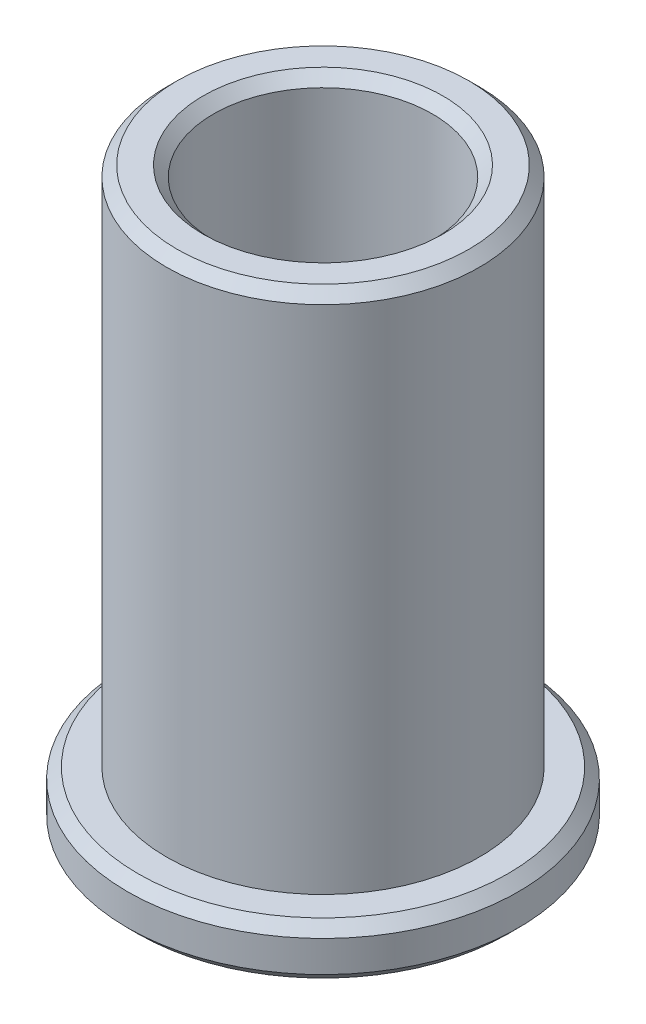
ISO-10303-21;
HEADER;
FILE_DESCRIPTION(('STEP AP214'),'2;1');
FILE_NAME('part.step','',(''),(''),'','','');
FILE_SCHEMA(('AUTOMOTIVE_DESIGN { 1 0 10303 214 1 1 1 1 }'));
ENDSEC;
DATA;
#1=APPLICATION_CONTEXT('core data for automotive mechanical design processes');
#2=APPLICATION_PROTOCOL_DEFINITION('international standard','automotive_design',2000,#1);
#3=PRODUCT_CONTEXT('',#1,'mechanical');
#4=PRODUCT('Part','Part','',(#3));
#5=PRODUCT_RELATED_PRODUCT_CATEGORY('part','',(#4));
#6=PRODUCT_DEFINITION_FORMATION('','',#4);
#7=PRODUCT_DEFINITION_CONTEXT('part definition',#1,'design');
#8=PRODUCT_DEFINITION('design','',#6,#7);
#9=PRODUCT_DEFINITION_SHAPE('','',#8);
#10=(LENGTH_UNIT() NAMED_UNIT(*) SI_UNIT(.MILLI.,.METRE.));
#11=(NAMED_UNIT(*) PLANE_ANGLE_UNIT() SI_UNIT($,.RADIAN.));
#12=(NAMED_UNIT(*) SI_UNIT($,.STERADIAN.) SOLID_ANGLE_UNIT());
#13=UNCERTAINTY_MEASURE_WITH_UNIT(LENGTH_MEASURE(1.E-05),#10,'distance_accuracy_value','');
#14=(GEOMETRIC_REPRESENTATION_CONTEXT(3) GLOBAL_UNCERTAINTY_ASSIGNED_CONTEXT((#13)) GLOBAL_UNIT_ASSIGNED_CONTEXT((#10,
#11,#12)) REPRESENTATION_CONTEXT('',''));
#15=CARTESIAN_POINT('',(0.,0.,0.));
#16=DIRECTION('',(0.,0.,1.));
#17=DIRECTION('',(1.,0.,0.));
#18=AXIS2_PLACEMENT_3D('',#15,#16,#17);
#19=CARTESIAN_POINT('',(0.,1.,0.));
#20=DIRECTION('',(0.,-1.,0.));
#21=DIRECTION('',(0.,0.,-1.));
#22=AXIS2_PLACEMENT_3D('',#19,#20,#21);
#23=CYLINDRICAL_SURFACE('',#22,3.75);
#24=CARTESIAN_POINT('',(0.,0.2,0.));
#25=DIRECTION('',(0.,1.,0.));
#26=DIRECTION('',(0.,0.,1.));
#27=AXIS2_PLACEMENT_3D('',#24,#25,#26);
#28=CIRCLE('',#27,3.75);
#29=CARTESIAN_POINT('',(0.,0.2,3.75));
#30=VERTEX_POINT('',#29);
#31=EDGE_CURVE('E10',#30,#30,#28,.T.);
#32=ORIENTED_EDGE('',*,*,#31,.T.);
#33=EDGE_LOOP('',(#32));
#34=FACE_BOUND('',#33,.T.);
#35=CARTESIAN_POINT('',(0.,0.8,0.));
#36=DIRECTION('',(0.,1.,0.));
#37=DIRECTION('',(0.,0.,1.));
#38=AXIS2_PLACEMENT_3D('',#35,#36,#37);
#39=CIRCLE('',#38,3.75);
#40=CARTESIAN_POINT('',(0.,0.8,-3.75));
#41=VERTEX_POINT('',#40);
#42=EDGE_CURVE('E88',#41,#41,#39,.F.);
#43=ORIENTED_EDGE('',*,*,#42,.T.);
#44=EDGE_LOOP('',(#43));
#45=FACE_BOUND('',#44,.T.);
#46=ADVANCED_FACE('F44',(#34,#45),#23,.T.);
#47=CARTESIAN_POINT('',(0.,1.,0.));
#48=DIRECTION('',(0.,1.,0.));
#49=DIRECTION('',(0.,0.,1.));
#50=AXIS2_PLACEMENT_3D('',#47,#48,#49);
#51=PLANE('',#50);
#52=CARTESIAN_POINT('',(0.,1.,0.));
#53=DIRECTION('',(0.,1.,0.));
#54=DIRECTION('',(0.,0.,1.));
#55=AXIS2_PLACEMENT_3D('',#52,#53,#54);
#56=CIRCLE('',#55,3.55);
#57=CARTESIAN_POINT('',(0.,1.,-3.55));
#58=VERTEX_POINT('',#57);
#59=EDGE_CURVE('E89',#58,#58,#56,.T.);
#60=ORIENTED_EDGE('',*,*,#59,.T.);
#61=EDGE_LOOP('',(#60));
#62=FACE_BOUND('',#61,.T.);
#63=CARTESIAN_POINT('',(0.,1.,0.));
#64=DIRECTION('',(0.,1.,0.));
#65=DIRECTION('',(0.,0.,1.));
#66=AXIS2_PLACEMENT_3D('',#63,#64,#65);
#67=CIRCLE('',#66,3.);
#68=CARTESIAN_POINT('',(0.,1.,3.));
#69=VERTEX_POINT('',#68);
#70=EDGE_CURVE('E94',#69,#69,#67,.T.);
#71=ORIENTED_EDGE('',*,*,#70,.F.);
#72=EDGE_LOOP('',(#71));
#73=FACE_BOUND('',#72,.T.);
#74=ADVANCED_FACE('F101',(#62,#73),#51,.T.);
#75=CARTESIAN_POINT('',(0.,0.,0.));
#76=DIRECTION('',(0.,1.,0.));
#77=DIRECTION('',(0.,0.,1.));
#78=AXIS2_PLACEMENT_3D('',#75,#76,#77);
#79=PLANE('',#78);
#80=CARTESIAN_POINT('',(0.,0.,0.));
#81=DIRECTION('',(0.,1.,0.));
#82=DIRECTION('',(0.,0.,1.));
#83=AXIS2_PLACEMENT_3D('',#80,#81,#82);
#84=CIRCLE('',#83,2.3);
#85=CARTESIAN_POINT('',(0.,0.,2.3));
#86=VERTEX_POINT('',#85);
#87=EDGE_CURVE('E53',#86,#86,#84,.T.);
#88=ORIENTED_EDGE('',*,*,#87,.T.);
#89=EDGE_LOOP('',(#88));
#90=FACE_BOUND('',#89,.T.);
#91=CARTESIAN_POINT('',(0.,0.,0.));
#92=DIRECTION('',(0.,1.,0.));
#93=DIRECTION('',(0.,0.,1.));
#94=AXIS2_PLACEMENT_3D('',#91,#92,#93);
#95=CIRCLE('',#94,3.55);
#96=CARTESIAN_POINT('',(0.,0.,3.55));
#97=VERTEX_POINT('',#96);
#98=EDGE_CURVE('E56',#97,#97,#95,.F.);
#99=ORIENTED_EDGE('',*,*,#98,.T.);
#100=EDGE_LOOP('',(#99));
#101=FACE_BOUND('',#100,.T.);
#102=ADVANCED_FACE('F103',(#90,#101),#79,.F.);
#103=CARTESIAN_POINT('',(0.,11.,0.));
#104=DIRECTION('',(0.,-1.,0.));
#105=DIRECTION('',(0.,0.,-1.));
#106=AXIS2_PLACEMENT_3D('',#103,#104,#105);
#107=CYLINDRICAL_SURFACE('',#106,3.);
#108=CARTESIAN_POINT('',(0.,10.8,0.));
#109=DIRECTION('',(0.,1.,0.));
#110=DIRECTION('',(0.,0.,1.));
#111=AXIS2_PLACEMENT_3D('',#108,#109,#110);
#112=CIRCLE('',#111,3.);
#113=CARTESIAN_POINT('',(0.,10.8,3.));
#114=VERTEX_POINT('',#113);
#115=EDGE_CURVE('E77',#114,#114,#112,.F.);
#116=ORIENTED_EDGE('',*,*,#115,.T.);
#117=EDGE_LOOP('',(#116));
#118=FACE_BOUND('',#117,.T.);
#119=ORIENTED_EDGE('',*,*,#70,.T.);
#120=EDGE_LOOP('',(#119));
#121=FACE_BOUND('',#120,.T.);
#122=ADVANCED_FACE('F97',(#118,#121),#107,.T.);
#123=CARTESIAN_POINT('',(0.,11.,0.));
#124=DIRECTION('',(0.,1.,0.));
#125=DIRECTION('',(0.,0.,1.));
#126=AXIS2_PLACEMENT_3D('',#123,#124,#125);
#127=PLANE('',#126);
#128=CARTESIAN_POINT('',(0.,11.,0.));
#129=DIRECTION('',(0.,1.,0.));
#130=DIRECTION('',(0.,0.,1.));
#131=AXIS2_PLACEMENT_3D('',#128,#129,#130);
#132=CIRCLE('',#131,2.3);
#133=CARTESIAN_POINT('',(0.,11.,2.3));
#134=VERTEX_POINT('',#133);
#135=EDGE_CURVE('E63',#134,#134,#132,.F.);
#136=ORIENTED_EDGE('',*,*,#135,.T.);
#137=EDGE_LOOP('',(#136));
#138=FACE_BOUND('',#137,.T.);
#139=CARTESIAN_POINT('',(0.,11.,0.));
#140=DIRECTION('',(0.,1.,0.));
#141=DIRECTION('',(0.,0.,1.));
#142=AXIS2_PLACEMENT_3D('',#139,#140,#141);
#143=CIRCLE('',#142,2.8);
#144=CARTESIAN_POINT('',(0.,11.,2.8));
#145=VERTEX_POINT('',#144);
#146=EDGE_CURVE('E85',#145,#145,#143,.T.);
#147=ORIENTED_EDGE('',*,*,#146,.T.);
#148=EDGE_LOOP('',(#147));
#149=FACE_BOUND('',#148,.T.);
#150=ADVANCED_FACE('F151',(#138,#149),#127,.T.);
#151=CARTESIAN_POINT('',(0.,0.,0.));
#152=DIRECTION('',(0.,1.,0.));
#153=DIRECTION('',(0.,0.,1.));
#154=AXIS2_PLACEMENT_3D('',#151,#152,#153);
#155=CYLINDRICAL_SURFACE('',#154,2.1);
#156=CARTESIAN_POINT('',(0.,10.8,0.));
#157=DIRECTION('',(0.,1.,0.));
#158=DIRECTION('',(0.,0.,1.));
#159=AXIS2_PLACEMENT_3D('',#156,#157,#158);
#160=CIRCLE('',#159,2.1);
#161=CARTESIAN_POINT('',(0.,10.8,2.1));
#162=VERTEX_POINT('',#161);
#163=EDGE_CURVE('E69',#162,#162,#160,.T.);
#164=ORIENTED_EDGE('',*,*,#163,.T.);
#165=EDGE_LOOP('',(#164));
#166=FACE_BOUND('',#165,.T.);
#167=CARTESIAN_POINT('',(0.,0.200000000000001,0.));
#168=DIRECTION('',(0.,1.,0.));
#169=DIRECTION('',(0.,0.,1.));
#170=AXIS2_PLACEMENT_3D('',#167,#168,#169);
#171=CIRCLE('',#170,2.1);
#172=CARTESIAN_POINT('',(0.,0.200000000000001,2.1));
#173=VERTEX_POINT('',#172);
#174=EDGE_CURVE('E74',#173,#173,#171,.F.);
#175=ORIENTED_EDGE('',*,*,#174,.T.);
#176=EDGE_LOOP('',(#175));
#177=FACE_BOUND('',#176,.T.);
#178=ADVANCED_FACE('F123',(#166,#177),#155,.F.);
#179=CARTESIAN_POINT('',(0.,1.,0.));
#180=DIRECTION('',(0.,-1.,0.));
#181=DIRECTION('',(0.,0.,-1.));
#182=AXIS2_PLACEMENT_3D('',#179,#180,#181);
#183=CONICAL_SURFACE('',#182,3.55,0.785398163397446);
#184=CARTESIAN_POINT('',(0.,0.8,-3.75));
#185=CARTESIAN_POINT('',(0.,0.802083333333334,-3.74791666666667));
#186=CARTESIAN_POINT('',(0.,0.804166666666667,-3.74583333333333));
#187=CARTESIAN_POINT('',(0.,0.808333333333334,-3.74166666666667));
#188=CARTESIAN_POINT('',(0.,0.810416666666667,-3.73958333333333));
#189=CARTESIAN_POINT('',(0.,0.814583333333334,-3.73541666666667));
#190=CARTESIAN_POINT('',(0.,0.816666666666667,-3.73333333333333));
#191=CARTESIAN_POINT('',(0.,0.820833333333334,-3.72916666666667));
#192=CARTESIAN_POINT('',(0.,0.822916666666667,-3.72708333333333));
#193=CARTESIAN_POINT('',(0.,0.827083333333334,-3.72291666666667));
#194=CARTESIAN_POINT('',(0.,0.829166666666667,-3.72083333333333));
#195=CARTESIAN_POINT('',(0.,0.833333333333334,-3.71666666666667));
#196=CARTESIAN_POINT('',(0.,0.835416666666667,-3.71458333333333));
#197=CARTESIAN_POINT('',(0.,0.839583333333334,-3.71041666666667));
#198=CARTESIAN_POINT('',(0.,0.841666666666667,-3.70833333333333));
#199=CARTESIAN_POINT('',(0.,0.845833333333334,-3.70416666666667));
#200=CARTESIAN_POINT('',(0.,0.847916666666667,-3.70208333333333));
#201=CARTESIAN_POINT('',(0.,0.852083333333334,-3.69791666666667));
#202=CARTESIAN_POINT('',(0.,0.854166666666667,-3.69583333333333));
#203=CARTESIAN_POINT('',(0.,0.858333333333334,-3.69166666666667));
#204=CARTESIAN_POINT('',(0.,0.860416666666667,-3.68958333333333));
#205=CARTESIAN_POINT('',(0.,0.864583333333333,-3.68541666666667));
#206=CARTESIAN_POINT('',(0.,0.866666666666667,-3.68333333333333));
#207=CARTESIAN_POINT('',(0.,0.870833333333333,-3.67916666666667));
#208=CARTESIAN_POINT('',(0.,0.872916666666667,-3.67708333333333));
#209=CARTESIAN_POINT('',(0.,0.877083333333333,-3.67291666666667));
#210=CARTESIAN_POINT('',(0.,0.879166666666667,-3.67083333333333));
#211=CARTESIAN_POINT('',(0.,0.883333333333334,-3.66666666666667));
#212=CARTESIAN_POINT('',(0.,0.885416666666667,-3.66458333333333));
#213=CARTESIAN_POINT('',(0.,0.889583333333334,-3.66041666666667));
#214=CARTESIAN_POINT('',(0.,0.891666666666667,-3.65833333333333));
#215=CARTESIAN_POINT('',(0.,0.895833333333333,-3.65416666666667));
#216=CARTESIAN_POINT('',(0.,0.897916666666667,-3.65208333333333));
#217=CARTESIAN_POINT('',(0.,0.902083333333333,-3.64791666666667));
#218=CARTESIAN_POINT('',(0.,0.904166666666667,-3.64583333333333));
#219=CARTESIAN_POINT('',(0.,0.908333333333333,-3.64166666666667));
#220=CARTESIAN_POINT('',(0.,0.910416666666667,-3.63958333333333));
#221=CARTESIAN_POINT('',(0.,0.914583333333333,-3.63541666666667));
#222=CARTESIAN_POINT('',(0.,0.916666666666667,-3.63333333333333));
#223=CARTESIAN_POINT('',(0.,0.920833333333333,-3.62916666666667));
#224=CARTESIAN_POINT('',(0.,0.922916666666667,-3.62708333333333));
#225=CARTESIAN_POINT('',(0.,0.927083333333333,-3.62291666666667));
#226=CARTESIAN_POINT('',(0.,0.929166666666667,-3.62083333333333));
#227=CARTESIAN_POINT('',(0.,0.933333333333333,-3.61666666666667));
#228=CARTESIAN_POINT('',(0.,0.935416666666667,-3.61458333333333));
#229=CARTESIAN_POINT('',(0.,0.939583333333333,-3.61041666666667));
#230=CARTESIAN_POINT('',(0.,0.941666666666667,-3.60833333333333));
#231=CARTESIAN_POINT('',(0.,0.945833333333333,-3.60416666666667));
#232=CARTESIAN_POINT('',(0.,0.947916666666667,-3.60208333333333));
#233=CARTESIAN_POINT('',(0.,0.952083333333333,-3.59791666666667));
#234=CARTESIAN_POINT('',(0.,0.954166666666667,-3.59583333333333));
#235=CARTESIAN_POINT('',(0.,0.958333333333333,-3.59166666666667));
#236=CARTESIAN_POINT('',(0.,0.960416666666667,-3.58958333333333));
#237=CARTESIAN_POINT('',(0.,0.964583333333333,-3.58541666666667));
#238=CARTESIAN_POINT('',(0.,0.966666666666667,-3.58333333333333));
#239=CARTESIAN_POINT('',(0.,0.970833333333333,-3.57916666666667));
#240=CARTESIAN_POINT('',(0.,0.972916666666667,-3.57708333333333));
#241=CARTESIAN_POINT('',(0.,0.977083333333333,-3.57291666666667));
#242=CARTESIAN_POINT('',(0.,0.979166666666667,-3.57083333333333));
#243=CARTESIAN_POINT('',(0.,0.983333333333333,-3.56666666666667));
#244=CARTESIAN_POINT('',(0.,0.985416666666667,-3.56458333333333));
#245=CARTESIAN_POINT('',(0.,0.989583333333333,-3.56041666666667));
#246=CARTESIAN_POINT('',(0.,0.991666666666666,-3.55833333333333));
#247=CARTESIAN_POINT('',(0.,0.995833333333333,-3.55416666666667));
#248=CARTESIAN_POINT('',(0.,0.997916666666667,-3.55208333333333));
#249=CARTESIAN_POINT('',(0.,1.,-3.55));
#250=B_SPLINE_CURVE_WITH_KNOTS('',3,(#184,#185,#186,#187,#188,#189,#190,#191,#192,#193,#194,
#195,#196,#197,#198,#199,#200,#201,#202,#203,#204,#205,#206,#207,#208,#209,#210,#211,#212,#213,
#214,#215,#216,#217,#218,#219,#220,#221,#222,#223,#224,#225,#226,#227,#228,#229,#230,#231,#232,
#233,#234,#235,#236,#237,#238,#239,#240,#241,#242,#243,#244,#245,#246,#247,#248,#249),
.UNSPECIFIED.,.F.,.F.,(4,2,2,2,2,2,2,2,2,2,2,2,2,2,2,2,2,2,2,2,2,2,2,2,2,2,2,2,2,2,2,2,4),(0.,
0.00883883476483171,0.0176776695296637,0.0265165042944953,0.0353553390593272,0.0441941738241589,
0.0530330085889909,0.0618718433538225,0.0707106781186545,0.0795495128834862,0.0883883476483181,
0.0972271824131498,0.106066017177982,0.114904851942813,0.123743686707645,0.132582521472477,
0.141421356237309,0.150260191002141,0.159099025766973,0.167937860531804,0.176776695296636,
0.185615530061468,0.1944543648263,0.203293199591131,0.212132034355963,0.220970869120795,
0.229809703885627,0.238648538650459,0.247487373415291,0.256326208180122,0.265165042944954,
0.274003877709786,0.282842712474618),.UNSPECIFIED.);
#251=EDGE_CURVE('BSEAM120',#41,#58,#250,.T.);
#252=ORIENTED_EDGE('',*,*,#42,.F.);
#253=ORIENTED_EDGE('',*,*,#59,.F.);
#254=ORIENTED_EDGE('',*,*,#251,.T.);
#255=ORIENTED_EDGE('',*,*,#251,.F.);
#256=EDGE_LOOP('',(#252,#254,#253,#255));
#257=FACE_BOUND('',#256,.T.);
#258=ADVANCED_FACE('F120',(#257),#183,.T.);
#259=CARTESIAN_POINT('',(0.,11.,0.));
#260=DIRECTION('',(0.,-1.,0.));
#261=DIRECTION('',(0.,0.,-1.));
#262=AXIS2_PLACEMENT_3D('',#259,#260,#261);
#263=CONICAL_SURFACE('',#262,2.8,0.785398163397444);
#264=ORIENTED_EDGE('',*,*,#115,.F.);
#265=EDGE_LOOP('',(#264));
#266=FACE_BOUND('',#265,.T.);
#267=ORIENTED_EDGE('',*,*,#146,.F.);
#268=EDGE_LOOP('',(#267));
#269=FACE_BOUND('',#268,.T.);
#270=ADVANCED_FACE('F122',(#266,#269),#263,.T.);
#271=CARTESIAN_POINT('',(0.,10.8,0.));
#272=DIRECTION('',(0.,1.,0.));
#273=DIRECTION('',(0.,0.,1.));
#274=AXIS2_PLACEMENT_3D('',#271,#272,#273);
#275=CONICAL_SURFACE('',#274,2.1,0.78539816339745);
#276=ORIENTED_EDGE('',*,*,#135,.F.);
#277=EDGE_LOOP('',(#276));
#278=FACE_BOUND('',#277,.T.);
#279=ORIENTED_EDGE('',*,*,#163,.F.);
#280=EDGE_LOOP('',(#279));
#281=FACE_BOUND('',#280,.T.);
#282=ADVANCED_FACE('F131',(#278,#281),#275,.F.);
#283=CARTESIAN_POINT('',(0.,0.,0.));
#284=DIRECTION('',(0.,-1.,0.));
#285=DIRECTION('',(0.,0.,-1.));
#286=AXIS2_PLACEMENT_3D('',#283,#284,#285);
#287=CONICAL_SURFACE('',#286,2.3,0.785398163397446);
#288=ORIENTED_EDGE('',*,*,#174,.F.);
#289=EDGE_LOOP('',(#288));
#290=FACE_BOUND('',#289,.T.);
#291=ORIENTED_EDGE('',*,*,#87,.F.);
#292=EDGE_LOOP('',(#291));
#293=FACE_BOUND('',#292,.T.);
#294=ADVANCED_FACE('F140',(#290,#293),#287,.F.);
#295=CARTESIAN_POINT('',(0.,0.2,0.));
#296=DIRECTION('',(0.,1.,0.));
#297=DIRECTION('',(0.,0.,1.));
#298=AXIS2_PLACEMENT_3D('',#295,#296,#297);
#299=CONICAL_SURFACE('',#298,3.75,0.785398163397453);
#300=ORIENTED_EDGE('',*,*,#98,.F.);
#301=EDGE_LOOP('',(#300));
#302=FACE_BOUND('',#301,.T.);
#303=ORIENTED_EDGE('',*,*,#31,.F.);
#304=EDGE_LOOP('',(#303));
#305=FACE_BOUND('',#304,.T.);
#306=ADVANCED_FACE('F48',(#302,#305),#299,.T.);
#307=CLOSED_SHELL('',(#46,#74,#102,#122,#150,#178,#258,#270,#282,#294,#306));
#308=MANIFOLD_SOLID_BREP('B2',#307);
#309=ADVANCED_BREP_SHAPE_REPRESENTATION('',(#18,#308),#14);
#310=SHAPE_DEFINITION_REPRESENTATION(#9,#309);
ENDSEC;
END-ISO-10303-21;
